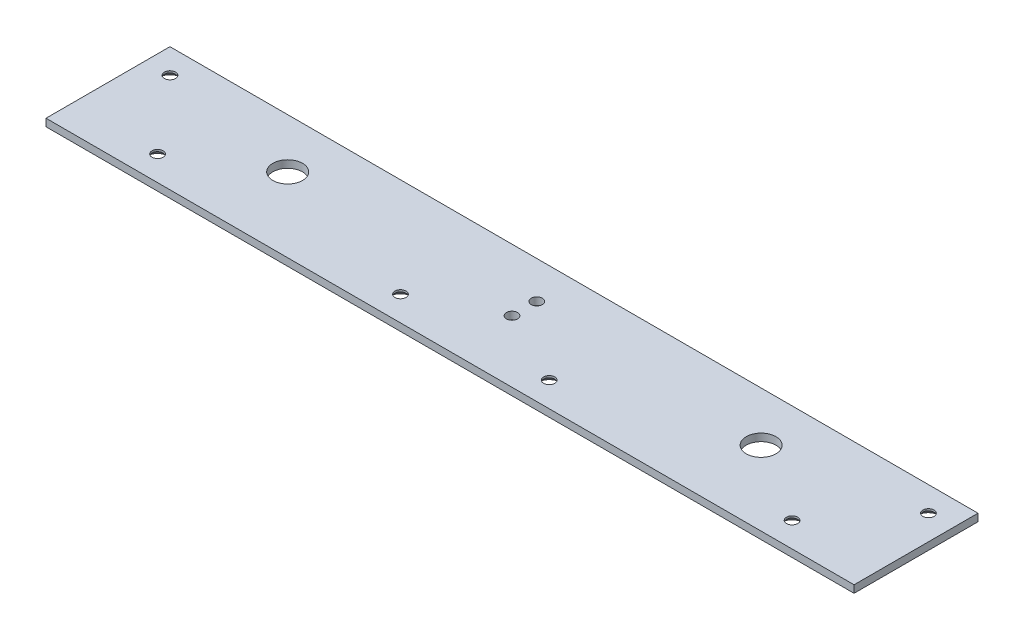
ISO-10303-21;
HEADER;
FILE_DESCRIPTION(('STEP AP214'),'2;1');
FILE_NAME('part.step','',(''),(''),'','','');
FILE_SCHEMA(('AUTOMOTIVE_DESIGN { 1 0 10303 214 1 1 1 1 }'));
ENDSEC;
DATA;
#1=APPLICATION_CONTEXT('core data for automotive mechanical design processes');
#2=APPLICATION_PROTOCOL_DEFINITION('international standard','automotive_design',2000,#1);
#3=PRODUCT_CONTEXT('',#1,'mechanical');
#4=PRODUCT('Part','Part','',(#3));
#5=PRODUCT_RELATED_PRODUCT_CATEGORY('part','',(#4));
#6=PRODUCT_DEFINITION_FORMATION('','',#4);
#7=PRODUCT_DEFINITION_CONTEXT('part definition',#1,'design');
#8=PRODUCT_DEFINITION('design','',#6,#7);
#9=PRODUCT_DEFINITION_SHAPE('','',#8);
#10=(LENGTH_UNIT() NAMED_UNIT(*) SI_UNIT(.MILLI.,.METRE.));
#11=(NAMED_UNIT(*) PLANE_ANGLE_UNIT() SI_UNIT($,.RADIAN.));
#12=(NAMED_UNIT(*) SI_UNIT($,.STERADIAN.) SOLID_ANGLE_UNIT());
#13=UNCERTAINTY_MEASURE_WITH_UNIT(LENGTH_MEASURE(1.E-05),#10,'distance_accuracy_value','');
#14=(GEOMETRIC_REPRESENTATION_CONTEXT(3) GLOBAL_UNCERTAINTY_ASSIGNED_CONTEXT((#13)) GLOBAL_UNIT_ASSIGNED_CONTEXT((#10,
#11,#12)) REPRESENTATION_CONTEXT('',''));
#15=CARTESIAN_POINT('',(0.,0.,0.));
#16=DIRECTION('',(0.,0.,1.));
#17=DIRECTION('',(1.,0.,0.));
#18=AXIS2_PLACEMENT_3D('',#15,#16,#17);
#19=CARTESIAN_POINT('',(163.,3.,25.));
#20=DIRECTION('',(-1.,0.,0.));
#21=DIRECTION('',(0.,0.,1.));
#22=AXIS2_PLACEMENT_3D('',#19,#20,#21);
#23=PLANE('',#22);
#24=DIRECTION('',(0.,0.,-1.));
#25=VECTOR('',#24,1.);
#26=CARTESIAN_POINT('',(163.,0.,25.));
#27=LINE('',#26,#25);
#28=CARTESIAN_POINT('',(163.,0.,25.));
#29=VERTEX_POINT('',#28);
#30=CARTESIAN_POINT('',(163.,0.,-25.));
#31=VERTEX_POINT('',#30);
#32=EDGE_CURVE('E110',#29,#31,#27,.T.);
#33=ORIENTED_EDGE('',*,*,#32,.T.);
#34=DIRECTION('',(0.,-1.,0.));
#35=VECTOR('',#34,1.);
#36=CARTESIAN_POINT('',(163.,3.,-25.));
#37=LINE('',#36,#35);
#38=CARTESIAN_POINT('',(163.,3.,-25.));
#39=VERTEX_POINT('',#38);
#40=EDGE_CURVE('E11',#39,#31,#37,.T.);
#41=ORIENTED_EDGE('',*,*,#40,.F.);
#42=DIRECTION('',(0.,0.,-1.));
#43=VECTOR('',#42,1.);
#44=CARTESIAN_POINT('',(163.,3.,25.));
#45=LINE('',#44,#43);
#46=CARTESIAN_POINT('',(163.,3.,25.));
#47=VERTEX_POINT('',#46);
#48=EDGE_CURVE('E98',#47,#39,#45,.T.);
#49=ORIENTED_EDGE('',*,*,#48,.F.);
#50=DIRECTION('',(0.,-1.,0.));
#51=VECTOR('',#50,1.);
#52=CARTESIAN_POINT('',(163.,3.,25.));
#53=LINE('',#52,#51);
#54=EDGE_CURVE('E106',#47,#29,#53,.T.);
#55=ORIENTED_EDGE('',*,*,#54,.T.);
#56=EDGE_LOOP('',(#33,#41,#49,#55));
#57=FACE_BOUND('',#56,.T.);
#58=ADVANCED_FACE('F47',(#57),#23,.F.);
#59=CARTESIAN_POINT('',(-163.,3.,-25.));
#60=DIRECTION('',(0.,0.,1.));
#61=DIRECTION('',(1.,0.,0.));
#62=AXIS2_PLACEMENT_3D('',#59,#60,#61);
#63=PLANE('',#62);
#64=DIRECTION('',(-1.,0.,0.));
#65=VECTOR('',#64,1.);
#66=CARTESIAN_POINT('',(-163.,0.,-25.));
#67=LINE('',#66,#65);
#68=CARTESIAN_POINT('',(-163.,0.,-25.));
#69=VERTEX_POINT('',#68);
#70=EDGE_CURVE('E102',#31,#69,#67,.T.);
#71=ORIENTED_EDGE('',*,*,#70,.T.);
#72=DIRECTION('',(0.,-1.,0.));
#73=VECTOR('',#72,1.);
#74=CARTESIAN_POINT('',(-163.,3.,-25.));
#75=LINE('',#74,#73);
#76=CARTESIAN_POINT('',(-163.,3.,-25.));
#77=VERTEX_POINT('',#76);
#78=EDGE_CURVE('E55',#77,#69,#75,.T.);
#79=ORIENTED_EDGE('',*,*,#78,.F.);
#80=DIRECTION('',(-1.,0.,0.));
#81=VECTOR('',#80,1.);
#82=CARTESIAN_POINT('',(-163.,3.,-25.));
#83=LINE('',#82,#81);
#84=EDGE_CURVE('E93',#39,#77,#83,.T.);
#85=ORIENTED_EDGE('',*,*,#84,.F.);
#86=ORIENTED_EDGE('',*,*,#40,.T.);
#87=EDGE_LOOP('',(#71,#79,#85,#86));
#88=FACE_BOUND('',#87,.T.);
#89=ADVANCED_FACE('F101',(#88),#63,.F.);
#90=CARTESIAN_POINT('',(-163.,3.,25.));
#91=DIRECTION('',(1.,0.,0.));
#92=DIRECTION('',(0.,0.,-1.));
#93=AXIS2_PLACEMENT_3D('',#90,#91,#92);
#94=PLANE('',#93);
#95=DIRECTION('',(0.,0.,1.));
#96=VECTOR('',#95,1.);
#97=CARTESIAN_POINT('',(-163.,0.,25.));
#98=LINE('',#97,#96);
#99=CARTESIAN_POINT('',(-163.,0.,25.));
#100=VERTEX_POINT('',#99);
#101=EDGE_CURVE('E80',#69,#100,#98,.T.);
#102=ORIENTED_EDGE('',*,*,#101,.T.);
#103=DIRECTION('',(0.,-1.,0.));
#104=VECTOR('',#103,1.);
#105=CARTESIAN_POINT('',(-163.,3.,25.));
#106=LINE('',#105,#104);
#107=CARTESIAN_POINT('',(-163.,3.,25.));
#108=VERTEX_POINT('',#107);
#109=EDGE_CURVE('E103',#108,#100,#106,.T.);
#110=ORIENTED_EDGE('',*,*,#109,.F.);
#111=DIRECTION('',(0.,0.,1.));
#112=VECTOR('',#111,1.);
#113=CARTESIAN_POINT('',(-163.,3.,25.));
#114=LINE('',#113,#112);
#115=EDGE_CURVE('E96',#77,#108,#114,.T.);
#116=ORIENTED_EDGE('',*,*,#115,.F.);
#117=ORIENTED_EDGE('',*,*,#78,.T.);
#118=EDGE_LOOP('',(#102,#110,#116,#117));
#119=FACE_BOUND('',#118,.T.);
#120=ADVANCED_FACE('F104',(#119),#94,.F.);
#121=CARTESIAN_POINT('',(-163.,3.,25.));
#122=DIRECTION('',(0.,0.,-1.));
#123=DIRECTION('',(-1.,0.,0.));
#124=AXIS2_PLACEMENT_3D('',#121,#122,#123);
#125=PLANE('',#124);
#126=DIRECTION('',(1.,0.,0.));
#127=VECTOR('',#126,1.);
#128=CARTESIAN_POINT('',(-163.,0.,25.));
#129=LINE('',#128,#127);
#130=EDGE_CURVE('E86',#100,#29,#129,.T.);
#131=ORIENTED_EDGE('',*,*,#130,.T.);
#132=ORIENTED_EDGE('',*,*,#54,.F.);
#133=DIRECTION('',(1.,0.,0.));
#134=VECTOR('',#133,1.);
#135=CARTESIAN_POINT('',(-163.,3.,25.));
#136=LINE('',#135,#134);
#137=EDGE_CURVE('E63',#108,#47,#136,.T.);
#138=ORIENTED_EDGE('',*,*,#137,.F.);
#139=ORIENTED_EDGE('',*,*,#109,.T.);
#140=EDGE_LOOP('',(#131,#132,#138,#139));
#141=FACE_BOUND('',#140,.T.);
#142=ADVANCED_FACE('F118',(#141),#125,.F.);
#143=CARTESIAN_POINT('',(0.,3.,0.));
#144=DIRECTION('',(0.,-1.,0.));
#145=DIRECTION('',(0.,0.,-1.));
#146=AXIS2_PLACEMENT_3D('',#143,#144,#145);
#147=PLANE('',#146);
#148=CARTESIAN_POINT('',(153.,3.,-15.));
#149=DIRECTION('',(0.,-1.,0.));
#150=DIRECTION('',(0.,0.,-1.));
#151=AXIS2_PLACEMENT_3D('',#148,#149,#150);
#152=CIRCLE('',#151,2.24999999999997);
#153=CARTESIAN_POINT('',(153.,3.,-17.25));
#154=VERTEX_POINT('',#153);
#155=EDGE_CURVE('E192',#154,#154,#152,.T.);
#156=ORIENTED_EDGE('',*,*,#155,.T.);
#157=EDGE_LOOP('',(#156));
#158=FACE_BOUND('',#157,.T.);
#159=CARTESIAN_POINT('',(-153.,3.,-15.));
#160=DIRECTION('',(0.,-1.,0.));
#161=DIRECTION('',(0.,0.,-1.));
#162=AXIS2_PLACEMENT_3D('',#159,#160,#161);
#163=CIRCLE('',#162,2.24999999999997);
#164=CARTESIAN_POINT('',(-153.,3.,-17.25));
#165=VERTEX_POINT('',#164);
#166=EDGE_CURVE('E183',#165,#165,#163,.T.);
#167=ORIENTED_EDGE('',*,*,#166,.T.);
#168=EDGE_LOOP('',(#167));
#169=FACE_BOUND('',#168,.T.);
#170=CARTESIAN_POINT('',(-128.,3.,15.));
#171=DIRECTION('',(0.,-1.,0.));
#172=DIRECTION('',(0.,0.,-1.));
#173=AXIS2_PLACEMENT_3D('',#170,#171,#172);
#174=CIRCLE('',#173,2.24999999999997);
#175=CARTESIAN_POINT('',(-128.,3.,12.75));
#176=VERTEX_POINT('',#175);
#177=EDGE_CURVE('E174',#176,#176,#174,.T.);
#178=ORIENTED_EDGE('',*,*,#177,.T.);
#179=EDGE_LOOP('',(#178));
#180=FACE_BOUND('',#179,.T.);
#181=CARTESIAN_POINT('',(-30.,3.,15.));
#182=DIRECTION('',(0.,-1.,0.));
#183=DIRECTION('',(0.,0.,-1.));
#184=AXIS2_PLACEMENT_3D('',#181,#182,#183);
#185=CIRCLE('',#184,2.24999999999999);
#186=CARTESIAN_POINT('',(-30.,3.,12.75));
#187=VERTEX_POINT('',#186);
#188=EDGE_CURVE('E165',#187,#187,#185,.T.);
#189=ORIENTED_EDGE('',*,*,#188,.T.);
#190=EDGE_LOOP('',(#189));
#191=FACE_BOUND('',#190,.T.);
#192=CARTESIAN_POINT('',(30.,3.,15.));
#193=DIRECTION('',(0.,-1.,0.));
#194=DIRECTION('',(0.,0.,-1.));
#195=AXIS2_PLACEMENT_3D('',#192,#193,#194);
#196=CIRCLE('',#195,2.24999999999999);
#197=CARTESIAN_POINT('',(30.,3.,12.75));
#198=VERTEX_POINT('',#197);
#199=EDGE_CURVE('E156',#198,#198,#196,.T.);
#200=ORIENTED_EDGE('',*,*,#199,.T.);
#201=EDGE_LOOP('',(#200));
#202=FACE_BOUND('',#201,.T.);
#203=CARTESIAN_POINT('',(128.,3.,15.));
#204=DIRECTION('',(0.,-1.,0.));
#205=DIRECTION('',(0.,0.,-1.));
#206=AXIS2_PLACEMENT_3D('',#203,#204,#205);
#207=CIRCLE('',#206,2.24999999999997);
#208=CARTESIAN_POINT('',(128.,3.,12.75));
#209=VERTEX_POINT('',#208);
#210=EDGE_CURVE('E147',#209,#209,#207,.T.);
#211=ORIENTED_EDGE('',*,*,#210,.T.);
#212=EDGE_LOOP('',(#211));
#213=FACE_BOUND('',#212,.T.);
#214=CARTESIAN_POINT('',(-95.5,3.,-5.));
#215=DIRECTION('',(0.,1.,0.));
#216=DIRECTION('',(0.,0.,1.));
#217=AXIS2_PLACEMENT_3D('',#214,#215,#216);
#218=CIRCLE('',#217,5.99999999999999);
#219=CARTESIAN_POINT('',(-95.5,3.,0.999999999999991));
#220=VERTEX_POINT('',#219);
#221=EDGE_CURVE('E144',#220,#220,#218,.T.);
#222=ORIENTED_EDGE('',*,*,#221,.F.);
#223=EDGE_LOOP('',(#222));
#224=FACE_BOUND('',#223,.T.);
#225=CARTESIAN_POINT('',(95.5,3.,-5.));
#226=DIRECTION('',(0.,1.,0.));
#227=DIRECTION('',(0.,0.,1.));
#228=AXIS2_PLACEMENT_3D('',#225,#226,#227);
#229=CIRCLE('',#228,5.99999999999999);
#230=CARTESIAN_POINT('',(95.5,3.,0.999999999999991));
#231=VERTEX_POINT('',#230);
#232=EDGE_CURVE('E138',#231,#231,#229,.T.);
#233=ORIENTED_EDGE('',*,*,#232,.F.);
#234=EDGE_LOOP('',(#233));
#235=FACE_BOUND('',#234,.T.);
#236=CARTESIAN_POINT('',(0.,3.,0.));
#237=DIRECTION('',(0.,1.,0.));
#238=DIRECTION('',(0.,0.,1.));
#239=AXIS2_PLACEMENT_3D('',#236,#237,#238);
#240=CIRCLE('',#239,2.25);
#241=CARTESIAN_POINT('',(0.,3.,2.25));
#242=VERTEX_POINT('',#241);
#243=EDGE_CURVE('E132',#242,#242,#240,.T.);
#244=ORIENTED_EDGE('',*,*,#243,.F.);
#245=EDGE_LOOP('',(#244));
#246=FACE_BOUND('',#245,.T.);
#247=CARTESIAN_POINT('',(0.,3.,-10.));
#248=DIRECTION('',(0.,1.,0.));
#249=DIRECTION('',(0.,0.,1.));
#250=AXIS2_PLACEMENT_3D('',#247,#248,#249);
#251=CIRCLE('',#250,2.25);
#252=CARTESIAN_POINT('',(0.,3.,-7.75));
#253=VERTEX_POINT('',#252);
#254=EDGE_CURVE('E126',#253,#253,#251,.T.);
#255=ORIENTED_EDGE('',*,*,#254,.F.);
#256=EDGE_LOOP('',(#255));
#257=FACE_BOUND('',#256,.T.);
#258=ORIENTED_EDGE('',*,*,#48,.T.);
#259=ORIENTED_EDGE('',*,*,#84,.T.);
#260=ORIENTED_EDGE('',*,*,#115,.T.);
#261=ORIENTED_EDGE('',*,*,#137,.T.);
#262=EDGE_LOOP('',(#258,#259,#260,#261));
#263=FACE_BOUND('',#262,.T.);
#264=ADVANCED_FACE('F94',(#158,#169,#180,#191,#202,#213,#224,#235,#246,#257,#263),#147,.F.);
#265=CARTESIAN_POINT('',(0.,0.,0.));
#266=DIRECTION('',(0.,-1.,0.));
#267=DIRECTION('',(0.,0.,-1.));
#268=AXIS2_PLACEMENT_3D('',#265,#266,#267);
#269=PLANE('',#268);
#270=CARTESIAN_POINT('',(153.,0.,-15.));
#271=DIRECTION('',(0.,-1.,0.));
#272=DIRECTION('',(0.,0.,-1.));
#273=AXIS2_PLACEMENT_3D('',#270,#271,#272);
#274=CIRCLE('',#273,4.48000000000001);
#275=CARTESIAN_POINT('',(153.,0.,-19.48));
#276=VERTEX_POINT('',#275);
#277=EDGE_CURVE('E198',#276,#276,#274,.T.);
#278=ORIENTED_EDGE('',*,*,#277,.F.);
#279=EDGE_LOOP('',(#278));
#280=FACE_BOUND('',#279,.T.);
#281=CARTESIAN_POINT('',(-153.,0.,-15.));
#282=DIRECTION('',(0.,-1.,0.));
#283=DIRECTION('',(0.,0.,-1.));
#284=AXIS2_PLACEMENT_3D('',#281,#282,#283);
#285=CIRCLE('',#284,4.48000000000001);
#286=CARTESIAN_POINT('',(-153.,0.,-19.48));
#287=VERTEX_POINT('',#286);
#288=EDGE_CURVE('E189',#287,#287,#285,.T.);
#289=ORIENTED_EDGE('',*,*,#288,.F.);
#290=EDGE_LOOP('',(#289));
#291=FACE_BOUND('',#290,.T.);
#292=CARTESIAN_POINT('',(-128.,0.,15.));
#293=DIRECTION('',(0.,-1.,0.));
#294=DIRECTION('',(0.,0.,-1.));
#295=AXIS2_PLACEMENT_3D('',#292,#293,#294);
#296=CIRCLE('',#295,4.48);
#297=CARTESIAN_POINT('',(-128.,0.,10.52));
#298=VERTEX_POINT('',#297);
#299=EDGE_CURVE('E180',#298,#298,#296,.T.);
#300=ORIENTED_EDGE('',*,*,#299,.F.);
#301=EDGE_LOOP('',(#300));
#302=FACE_BOUND('',#301,.T.);
#303=CARTESIAN_POINT('',(-30.,0.,15.));
#304=DIRECTION('',(0.,-1.,0.));
#305=DIRECTION('',(0.,0.,-1.));
#306=AXIS2_PLACEMENT_3D('',#303,#304,#305);
#307=CIRCLE('',#306,4.48);
#308=CARTESIAN_POINT('',(-30.,0.,10.52));
#309=VERTEX_POINT('',#308);
#310=EDGE_CURVE('E171',#309,#309,#307,.T.);
#311=ORIENTED_EDGE('',*,*,#310,.F.);
#312=EDGE_LOOP('',(#311));
#313=FACE_BOUND('',#312,.T.);
#314=CARTESIAN_POINT('',(30.,0.,15.));
#315=DIRECTION('',(0.,-1.,0.));
#316=DIRECTION('',(0.,0.,-1.));
#317=AXIS2_PLACEMENT_3D('',#314,#315,#316);
#318=CIRCLE('',#317,4.48);
#319=CARTESIAN_POINT('',(30.,0.,10.52));
#320=VERTEX_POINT('',#319);
#321=EDGE_CURVE('E162',#320,#320,#318,.T.);
#322=ORIENTED_EDGE('',*,*,#321,.F.);
#323=EDGE_LOOP('',(#322));
#324=FACE_BOUND('',#323,.T.);
#325=CARTESIAN_POINT('',(128.,0.,15.));
#326=DIRECTION('',(0.,-1.,0.));
#327=DIRECTION('',(0.,0.,-1.));
#328=AXIS2_PLACEMENT_3D('',#325,#326,#327);
#329=CIRCLE('',#328,4.48000000000001);
#330=CARTESIAN_POINT('',(128.,0.,10.52));
#331=VERTEX_POINT('',#330);
#332=EDGE_CURVE('E153',#331,#331,#329,.T.);
#333=ORIENTED_EDGE('',*,*,#332,.F.);
#334=EDGE_LOOP('',(#333));
#335=FACE_BOUND('',#334,.T.);
#336=CARTESIAN_POINT('',(-95.5,0.,-5.));
#337=DIRECTION('',(0.,1.,0.));
#338=DIRECTION('',(0.,0.,1.));
#339=AXIS2_PLACEMENT_3D('',#336,#337,#338);
#340=CIRCLE('',#339,6.00000000000001);
#341=CARTESIAN_POINT('',(-95.5,0.,1.00000000000001));
#342=VERTEX_POINT('',#341);
#343=EDGE_CURVE('E141',#342,#342,#340,.T.);
#344=ORIENTED_EDGE('',*,*,#343,.T.);
#345=EDGE_LOOP('',(#344));
#346=FACE_BOUND('',#345,.T.);
#347=CARTESIAN_POINT('',(95.5,0.,-5.));
#348=DIRECTION('',(0.,1.,0.));
#349=DIRECTION('',(0.,0.,1.));
#350=AXIS2_PLACEMENT_3D('',#347,#348,#349);
#351=CIRCLE('',#350,6.00000000000001);
#352=CARTESIAN_POINT('',(95.5,0.,1.00000000000001));
#353=VERTEX_POINT('',#352);
#354=EDGE_CURVE('E135',#353,#353,#351,.T.);
#355=ORIENTED_EDGE('',*,*,#354,.T.);
#356=EDGE_LOOP('',(#355));
#357=FACE_BOUND('',#356,.T.);
#358=CARTESIAN_POINT('',(0.,0.,0.));
#359=DIRECTION('',(0.,-1.,0.));
#360=DIRECTION('',(0.,0.,-1.));
#361=AXIS2_PLACEMENT_3D('',#358,#359,#360);
#362=CIRCLE('',#361,2.25);
#363=CARTESIAN_POINT('',(0.,0.,-2.25));
#364=VERTEX_POINT('',#363);
#365=EDGE_CURVE('E129',#364,#364,#362,.T.);
#366=ORIENTED_EDGE('',*,*,#365,.F.);
#367=EDGE_LOOP('',(#366));
#368=FACE_BOUND('',#367,.T.);
#369=CARTESIAN_POINT('',(0.,0.,-10.));
#370=DIRECTION('',(0.,-1.,0.));
#371=DIRECTION('',(0.,0.,-1.));
#372=AXIS2_PLACEMENT_3D('',#369,#370,#371);
#373=CIRCLE('',#372,2.25);
#374=CARTESIAN_POINT('',(0.,0.,-12.25));
#375=VERTEX_POINT('',#374);
#376=EDGE_CURVE('E113',#375,#375,#373,.T.);
#377=ORIENTED_EDGE('',*,*,#376,.F.);
#378=EDGE_LOOP('',(#377));
#379=FACE_BOUND('',#378,.T.);
#380=ORIENTED_EDGE('',*,*,#32,.F.);
#381=ORIENTED_EDGE('',*,*,#130,.F.);
#382=ORIENTED_EDGE('',*,*,#101,.F.);
#383=ORIENTED_EDGE('',*,*,#70,.F.);
#384=EDGE_LOOP('',(#380,#381,#382,#383));
#385=FACE_BOUND('',#384,.T.);
#386=ADVANCED_FACE('F121',(#280,#291,#302,#313,#324,#335,#346,#357,#368,#379,#385),#269,.T.);
#387=CARTESIAN_POINT('',(0.,3.,-10.));
#388=DIRECTION('',(0.,1.,0.));
#389=DIRECTION('',(0.,0.,1.));
#390=AXIS2_PLACEMENT_3D('',#387,#388,#389);
#391=CYLINDRICAL_SURFACE('',#390,2.25);
#392=ORIENTED_EDGE('',*,*,#254,.T.);
#393=EDGE_LOOP('',(#392));
#394=FACE_BOUND('',#393,.T.);
#395=ORIENTED_EDGE('',*,*,#376,.T.);
#396=EDGE_LOOP('',(#395));
#397=FACE_BOUND('',#396,.T.);
#398=ADVANCED_FACE('F206',(#394,#397),#391,.F.);
#399=CARTESIAN_POINT('',(0.,3.,0.));
#400=DIRECTION('',(0.,1.,0.));
#401=DIRECTION('',(0.,0.,1.));
#402=AXIS2_PLACEMENT_3D('',#399,#400,#401);
#403=CYLINDRICAL_SURFACE('',#402,2.25);
#404=ORIENTED_EDGE('',*,*,#243,.T.);
#405=EDGE_LOOP('',(#404));
#406=FACE_BOUND('',#405,.T.);
#407=ORIENTED_EDGE('',*,*,#365,.T.);
#408=EDGE_LOOP('',(#407));
#409=FACE_BOUND('',#408,.T.);
#410=ADVANCED_FACE('F227',(#406,#409),#403,.F.);
#411=CARTESIAN_POINT('',(95.5,3.,-5.));
#412=DIRECTION('',(0.,1.,0.));
#413=DIRECTION('',(0.,0.,1.));
#414=AXIS2_PLACEMENT_3D('',#411,#412,#413);
#415=CYLINDRICAL_SURFACE('',#414,6.);
#416=ORIENTED_EDGE('',*,*,#354,.F.);
#417=EDGE_LOOP('',(#416));
#418=FACE_BOUND('',#417,.T.);
#419=ORIENTED_EDGE('',*,*,#232,.T.);
#420=EDGE_LOOP('',(#419));
#421=FACE_BOUND('',#420,.T.);
#422=ADVANCED_FACE('F234',(#418,#421),#415,.F.);
#423=CARTESIAN_POINT('',(-95.5,3.,-5.));
#424=DIRECTION('',(0.,1.,0.));
#425=DIRECTION('',(0.,0.,1.));
#426=AXIS2_PLACEMENT_3D('',#423,#424,#425);
#427=CYLINDRICAL_SURFACE('',#426,6.);
#428=ORIENTED_EDGE('',*,*,#343,.F.);
#429=EDGE_LOOP('',(#428));
#430=FACE_BOUND('',#429,.T.);
#431=ORIENTED_EDGE('',*,*,#221,.T.);
#432=EDGE_LOOP('',(#431));
#433=FACE_BOUND('',#432,.T.);
#434=ADVANCED_FACE('F274',(#430,#433),#427,.F.);
#435=CARTESIAN_POINT('',(128.,0.,15.));
#436=DIRECTION('',(0.,-1.,0.));
#437=DIRECTION('',(0.,0.,-1.));
#438=AXIS2_PLACEMENT_3D('',#435,#436,#437);
#439=CYLINDRICAL_SURFACE('',#438,2.24999999999999);
#440=ORIENTED_EDGE('',*,*,#210,.F.);
#441=EDGE_LOOP('',(#440));
#442=FACE_BOUND('',#441,.T.);
#443=CARTESIAN_POINT('',(128.,2.23,15.));
#444=DIRECTION('',(0.,-1.,0.));
#445=DIRECTION('',(0.,0.,-1.));
#446=AXIS2_PLACEMENT_3D('',#443,#444,#445);
#447=CIRCLE('',#446,2.25);
#448=CARTESIAN_POINT('',(128.,2.23,12.75));
#449=VERTEX_POINT('',#448);
#450=EDGE_CURVE('E150',#449,#449,#447,.T.);
#451=ORIENTED_EDGE('',*,*,#450,.T.);
#452=EDGE_LOOP('',(#451));
#453=FACE_BOUND('',#452,.T.);
#454=ADVANCED_FACE('F279',(#442,#453),#439,.F.);
#455=CARTESIAN_POINT('',(128.,0.,15.));
#456=DIRECTION('',(0.,-1.,0.));
#457=DIRECTION('',(0.,0.,-1.));
#458=AXIS2_PLACEMENT_3D('',#455,#456,#457);
#459=CONICAL_SURFACE('',#458,4.48000000000001,0.78539816339745);
#460=ORIENTED_EDGE('',*,*,#450,.F.);
#461=EDGE_LOOP('',(#460));
#462=FACE_BOUND('',#461,.T.);
#463=ORIENTED_EDGE('',*,*,#332,.T.);
#464=EDGE_LOOP('',(#463));
#465=FACE_BOUND('',#464,.T.);
#466=ADVANCED_FACE('F285',(#462,#465),#459,.F.);
#467=CARTESIAN_POINT('',(30.,0.,15.));
#468=DIRECTION('',(0.,-1.,0.));
#469=DIRECTION('',(0.,0.,-1.));
#470=AXIS2_PLACEMENT_3D('',#467,#468,#469);
#471=CYLINDRICAL_SURFACE('',#470,2.25);
#472=ORIENTED_EDGE('',*,*,#199,.F.);
#473=EDGE_LOOP('',(#472));
#474=FACE_BOUND('',#473,.T.);
#475=CARTESIAN_POINT('',(30.,2.23,15.));
#476=DIRECTION('',(0.,-1.,0.));
#477=DIRECTION('',(0.,0.,-1.));
#478=AXIS2_PLACEMENT_3D('',#475,#476,#477);
#479=CIRCLE('',#478,2.25);
#480=CARTESIAN_POINT('',(30.,2.23,12.75));
#481=VERTEX_POINT('',#480);
#482=EDGE_CURVE('E159',#481,#481,#479,.T.);
#483=ORIENTED_EDGE('',*,*,#482,.T.);
#484=EDGE_LOOP('',(#483));
#485=FACE_BOUND('',#484,.T.);
#486=ADVANCED_FACE('F289',(#474,#485),#471,.F.);
#487=CARTESIAN_POINT('',(30.,0.,15.));
#488=DIRECTION('',(0.,-1.,0.));
#489=DIRECTION('',(0.,0.,-1.));
#490=AXIS2_PLACEMENT_3D('',#487,#488,#489);
#491=CONICAL_SURFACE('',#490,4.48,0.785398163397447);
#492=ORIENTED_EDGE('',*,*,#482,.F.);
#493=EDGE_LOOP('',(#492));
#494=FACE_BOUND('',#493,.T.);
#495=ORIENTED_EDGE('',*,*,#321,.T.);
#496=EDGE_LOOP('',(#495));
#497=FACE_BOUND('',#496,.T.);
#498=ADVANCED_FACE('F293',(#494,#497),#491,.F.);
#499=CARTESIAN_POINT('',(-30.,0.,15.));
#500=DIRECTION('',(0.,-1.,0.));
#501=DIRECTION('',(0.,0.,-1.));
#502=AXIS2_PLACEMENT_3D('',#499,#500,#501);
#503=CYLINDRICAL_SURFACE('',#502,2.24999999999999);
#504=ORIENTED_EDGE('',*,*,#188,.F.);
#505=EDGE_LOOP('',(#504));
#506=FACE_BOUND('',#505,.T.);
#507=CARTESIAN_POINT('',(-30.,2.23,15.));
#508=DIRECTION('',(0.,-1.,0.));
#509=DIRECTION('',(0.,0.,-1.));
#510=AXIS2_PLACEMENT_3D('',#507,#508,#509);
#511=CIRCLE('',#510,2.25);
#512=CARTESIAN_POINT('',(-30.,2.23,12.75));
#513=VERTEX_POINT('',#512);
#514=EDGE_CURVE('E168',#513,#513,#511,.T.);
#515=ORIENTED_EDGE('',*,*,#514,.T.);
#516=EDGE_LOOP('',(#515));
#517=FACE_BOUND('',#516,.T.);
#518=ADVANCED_FACE('F297',(#506,#517),#503,.F.);
#519=CARTESIAN_POINT('',(-30.,0.,15.));
#520=DIRECTION('',(0.,-1.,0.));
#521=DIRECTION('',(0.,0.,-1.));
#522=AXIS2_PLACEMENT_3D('',#519,#520,#521);
#523=CONICAL_SURFACE('',#522,4.48,0.785398163397449);
#524=ORIENTED_EDGE('',*,*,#514,.F.);
#525=EDGE_LOOP('',(#524));
#526=FACE_BOUND('',#525,.T.);
#527=ORIENTED_EDGE('',*,*,#310,.T.);
#528=EDGE_LOOP('',(#527));
#529=FACE_BOUND('',#528,.T.);
#530=ADVANCED_FACE('F301',(#526,#529),#523,.F.);
#531=CARTESIAN_POINT('',(-128.,0.,15.));
#532=DIRECTION('',(0.,-1.,0.));
#533=DIRECTION('',(0.,0.,-1.));
#534=AXIS2_PLACEMENT_3D('',#531,#532,#533);
#535=CYLINDRICAL_SURFACE('',#534,2.24999999999999);
#536=ORIENTED_EDGE('',*,*,#177,.F.);
#537=EDGE_LOOP('',(#536));
#538=FACE_BOUND('',#537,.T.);
#539=CARTESIAN_POINT('',(-128.,2.23,15.));
#540=DIRECTION('',(0.,-1.,0.));
#541=DIRECTION('',(0.,0.,-1.));
#542=AXIS2_PLACEMENT_3D('',#539,#540,#541);
#543=CIRCLE('',#542,2.25);
#544=CARTESIAN_POINT('',(-128.,2.23,12.75));
#545=VERTEX_POINT('',#544);
#546=EDGE_CURVE('E177',#545,#545,#543,.T.);
#547=ORIENTED_EDGE('',*,*,#546,.T.);
#548=EDGE_LOOP('',(#547));
#549=FACE_BOUND('',#548,.T.);
#550=ADVANCED_FACE('F305',(#538,#549),#535,.F.);
#551=CARTESIAN_POINT('',(-128.,0.,15.));
#552=DIRECTION('',(0.,-1.,0.));
#553=DIRECTION('',(0.,0.,-1.));
#554=AXIS2_PLACEMENT_3D('',#551,#552,#553);
#555=CONICAL_SURFACE('',#554,4.48,0.785398163397447);
#556=ORIENTED_EDGE('',*,*,#546,.F.);
#557=EDGE_LOOP('',(#556));
#558=FACE_BOUND('',#557,.T.);
#559=ORIENTED_EDGE('',*,*,#299,.T.);
#560=EDGE_LOOP('',(#559));
#561=FACE_BOUND('',#560,.T.);
#562=ADVANCED_FACE('F309',(#558,#561),#555,.F.);
#563=CARTESIAN_POINT('',(-153.,0.,-15.));
#564=DIRECTION('',(0.,-1.,0.));
#565=DIRECTION('',(0.,0.,-1.));
#566=AXIS2_PLACEMENT_3D('',#563,#564,#565);
#567=CYLINDRICAL_SURFACE('',#566,2.24999999999999);
#568=ORIENTED_EDGE('',*,*,#166,.F.);
#569=EDGE_LOOP('',(#568));
#570=FACE_BOUND('',#569,.T.);
#571=CARTESIAN_POINT('',(-153.,2.23,-15.));
#572=DIRECTION('',(0.,-1.,0.));
#573=DIRECTION('',(0.,0.,-1.));
#574=AXIS2_PLACEMENT_3D('',#571,#572,#573);
#575=CIRCLE('',#574,2.25);
#576=CARTESIAN_POINT('',(-153.,2.23,-17.25));
#577=VERTEX_POINT('',#576);
#578=EDGE_CURVE('E186',#577,#577,#575,.T.);
#579=ORIENTED_EDGE('',*,*,#578,.T.);
#580=EDGE_LOOP('',(#579));
#581=FACE_BOUND('',#580,.T.);
#582=ADVANCED_FACE('F313',(#570,#581),#567,.F.);
#583=CARTESIAN_POINT('',(-153.,0.,-15.));
#584=DIRECTION('',(0.,-1.,0.));
#585=DIRECTION('',(0.,0.,-1.));
#586=AXIS2_PLACEMENT_3D('',#583,#584,#585);
#587=CONICAL_SURFACE('',#586,4.48000000000001,0.78539816339745);
#588=ORIENTED_EDGE('',*,*,#578,.F.);
#589=EDGE_LOOP('',(#588));
#590=FACE_BOUND('',#589,.T.);
#591=ORIENTED_EDGE('',*,*,#288,.T.);
#592=EDGE_LOOP('',(#591));
#593=FACE_BOUND('',#592,.T.);
#594=ADVANCED_FACE('F317',(#590,#593),#587,.F.);
#595=CARTESIAN_POINT('',(153.,0.,-15.));
#596=DIRECTION('',(0.,-1.,0.));
#597=DIRECTION('',(0.,0.,-1.));
#598=AXIS2_PLACEMENT_3D('',#595,#596,#597);
#599=CYLINDRICAL_SURFACE('',#598,2.24999999999999);
#600=ORIENTED_EDGE('',*,*,#155,.F.);
#601=EDGE_LOOP('',(#600));
#602=FACE_BOUND('',#601,.T.);
#603=CARTESIAN_POINT('',(153.,2.23,-15.));
#604=DIRECTION('',(0.,-1.,0.));
#605=DIRECTION('',(0.,0.,-1.));
#606=AXIS2_PLACEMENT_3D('',#603,#604,#605);
#607=CIRCLE('',#606,2.25);
#608=CARTESIAN_POINT('',(153.,2.23,-17.25));
#609=VERTEX_POINT('',#608);
#610=EDGE_CURVE('E195',#609,#609,#607,.T.);
#611=ORIENTED_EDGE('',*,*,#610,.T.);
#612=EDGE_LOOP('',(#611));
#613=FACE_BOUND('',#612,.T.);
#614=ADVANCED_FACE('F321',(#602,#613),#599,.F.);
#615=CARTESIAN_POINT('',(153.,0.,-15.));
#616=DIRECTION('',(0.,-1.,0.));
#617=DIRECTION('',(0.,0.,-1.));
#618=AXIS2_PLACEMENT_3D('',#615,#616,#617);
#619=CONICAL_SURFACE('',#618,4.48000000000001,0.78539816339745);
#620=ORIENTED_EDGE('',*,*,#610,.F.);
#621=EDGE_LOOP('',(#620));
#622=FACE_BOUND('',#621,.T.);
#623=ORIENTED_EDGE('',*,*,#277,.T.);
#624=EDGE_LOOP('',(#623));
#625=FACE_BOUND('',#624,.T.);
#626=ADVANCED_FACE('F202',(#622,#625),#619,.F.);
#627=CLOSED_SHELL('',(#58,#89,#120,#142,#264,#386,#398,#410,#422,#434,#454,#466,#486,#498,#518,
#530,#550,#562,#582,#594,#614,#626));
#628=MANIFOLD_SOLID_BREP('B2',#627);
#629=ADVANCED_BREP_SHAPE_REPRESENTATION('',(#18,#628),#14);
#630=SHAPE_DEFINITION_REPRESENTATION(#9,#629);
ENDSEC;
END-ISO-10303-21;
